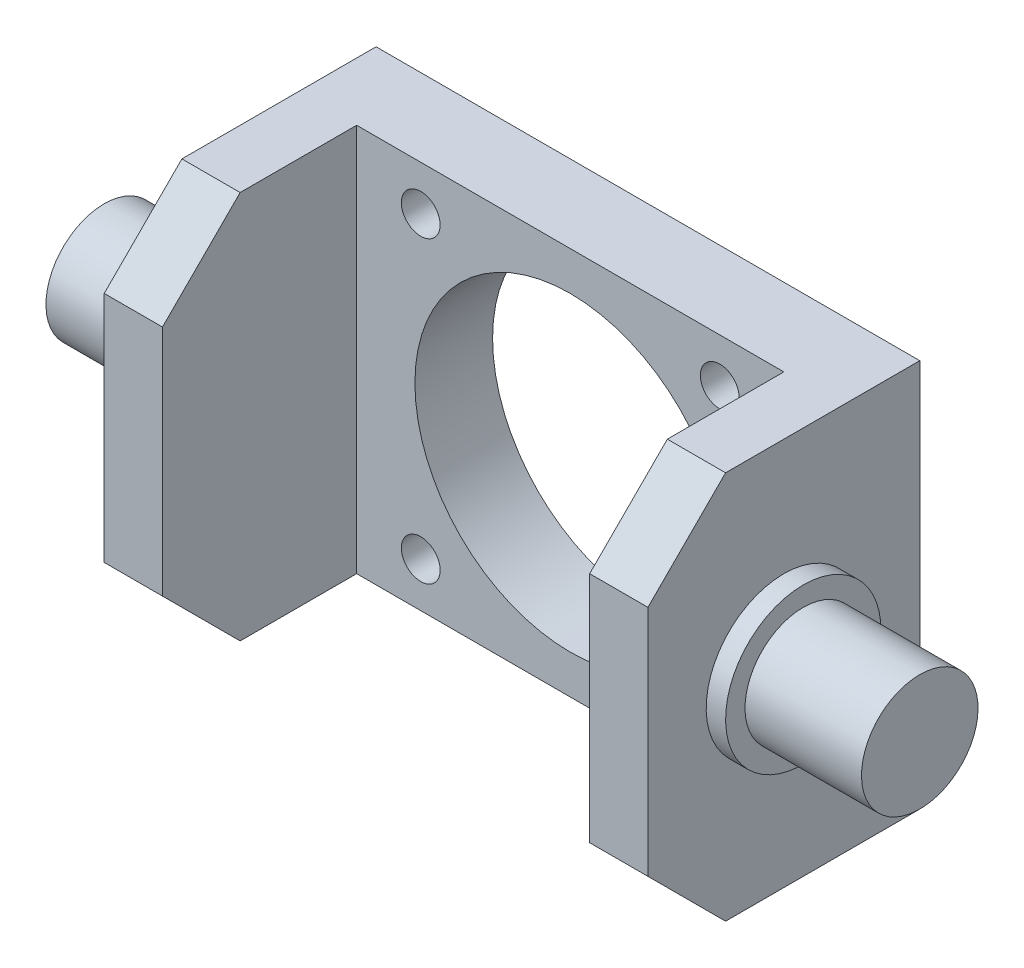
ISO-10303-21;
HEADER;
FILE_DESCRIPTION(('STEP AP214'),'2;1');
FILE_NAME('part.step','',(''),(''),'','','');
FILE_SCHEMA(('AUTOMOTIVE_DESIGN { 1 0 10303 214 1 1 1 1 }'));
ENDSEC;
DATA;
#1=APPLICATION_CONTEXT('core data for automotive mechanical design processes');
#2=APPLICATION_PROTOCOL_DEFINITION('international standard','automotive_design',2000,#1);
#3=PRODUCT_CONTEXT('',#1,'mechanical');
#4=PRODUCT('Part','Part','',(#3));
#5=PRODUCT_RELATED_PRODUCT_CATEGORY('part','',(#4));
#6=PRODUCT_DEFINITION_FORMATION('','',#4);
#7=PRODUCT_DEFINITION_CONTEXT('part definition',#1,'design');
#8=PRODUCT_DEFINITION('design','',#6,#7);
#9=PRODUCT_DEFINITION_SHAPE('','',#8);
#10=(LENGTH_UNIT() NAMED_UNIT(*) SI_UNIT(.MILLI.,.METRE.));
#11=(NAMED_UNIT(*) PLANE_ANGLE_UNIT() SI_UNIT($,.RADIAN.));
#12=(NAMED_UNIT(*) SI_UNIT($,.STERADIAN.) SOLID_ANGLE_UNIT());
#13=UNCERTAINTY_MEASURE_WITH_UNIT(LENGTH_MEASURE(1.E-05),#10,'distance_accuracy_value','');
#14=(GEOMETRIC_REPRESENTATION_CONTEXT(3) GLOBAL_UNCERTAINTY_ASSIGNED_CONTEXT((#13)) GLOBAL_UNIT_ASSIGNED_CONTEXT((#10,
#11,#12)) REPRESENTATION_CONTEXT('',''));
#15=CARTESIAN_POINT('',(0.,0.,0.));
#16=DIRECTION('',(0.,0.,1.));
#17=DIRECTION('',(1.,0.,0.));
#18=AXIS2_PLACEMENT_3D('',#15,#16,#17);
#19=CARTESIAN_POINT('',(0.,0.,4.));
#20=DIRECTION('',(0.,0.,1.));
#21=DIRECTION('',(1.,0.,0.));
#22=AXIS2_PLACEMENT_3D('',#19,#20,#21);
#23=PLANE('',#22);
#24=CARTESIAN_POINT('',(-7.7,7.7,4.));
#25=DIRECTION('',(0.,0.,1.));
#26=DIRECTION('',(1.,0.,0.));
#27=AXIS2_PLACEMENT_3D('',#24,#25,#26);
#28=CIRCLE('',#27,1.);
#29=CARTESIAN_POINT('',(-6.7,7.7,4.));
#30=VERTEX_POINT('',#29);
#31=EDGE_CURVE('E187',#30,#30,#28,.T.);
#32=ORIENTED_EDGE('',*,*,#31,.F.);
#33=EDGE_LOOP('',(#32));
#34=FACE_BOUND('',#33,.T.);
#35=CARTESIAN_POINT('',(0.,0.,4.));
#36=DIRECTION('',(0.,0.,1.));
#37=DIRECTION('',(1.,0.,0.));
#38=AXIS2_PLACEMENT_3D('',#35,#36,#37);
#39=CIRCLE('',#38,8.);
#40=CARTESIAN_POINT('',(8.,0.,4.));
#41=VERTEX_POINT('',#40);
#42=EDGE_CURVE('E203',#41,#41,#39,.T.);
#43=ORIENTED_EDGE('',*,*,#42,.F.);
#44=EDGE_LOOP('',(#43));
#45=FACE_BOUND('',#44,.T.);
#46=CARTESIAN_POINT('',(7.7,-7.7,4.));
#47=DIRECTION('',(0.,0.,1.));
#48=DIRECTION('',(1.,0.,0.));
#49=AXIS2_PLACEMENT_3D('',#46,#47,#48);
#50=CIRCLE('',#49,1.);
#51=CARTESIAN_POINT('',(8.7,-7.7,4.));
#52=VERTEX_POINT('',#51);
#53=EDGE_CURVE('E211',#52,#52,#50,.T.);
#54=ORIENTED_EDGE('',*,*,#53,.F.);
#55=EDGE_LOOP('',(#54));
#56=FACE_BOUND('',#55,.T.);
#57=CARTESIAN_POINT('',(-7.7,-7.7,4.));
#58=DIRECTION('',(0.,0.,1.));
#59=DIRECTION('',(1.,0.,0.));
#60=AXIS2_PLACEMENT_3D('',#57,#58,#59);
#61=CIRCLE('',#60,1.);
#62=CARTESIAN_POINT('',(-6.69999999999999,-7.7,4.));
#63=VERTEX_POINT('',#62);
#64=EDGE_CURVE('E195',#63,#63,#61,.T.);
#65=ORIENTED_EDGE('',*,*,#64,.F.);
#66=EDGE_LOOP('',(#65));
#67=FACE_BOUND('',#66,.T.);
#68=CARTESIAN_POINT('',(7.7,7.7,4.));
#69=DIRECTION('',(0.,0.,1.));
#70=DIRECTION('',(1.,0.,0.));
#71=AXIS2_PLACEMENT_3D('',#68,#69,#70);
#72=CIRCLE('',#71,1.);
#73=CARTESIAN_POINT('',(8.7,7.7,4.));
#74=VERTEX_POINT('',#73);
#75=EDGE_CURVE('E179',#74,#74,#72,.T.);
#76=ORIENTED_EDGE('',*,*,#75,.F.);
#77=EDGE_LOOP('',(#76));
#78=FACE_BOUND('',#77,.T.);
#79=DIRECTION('',(1.,0.,0.));
#80=VECTOR('',#79,1.);
#81=CARTESIAN_POINT('',(-14.,-10.,4.));
#82=LINE('',#81,#80);
#83=CARTESIAN_POINT('',(-11.,-10.,4.));
#84=VERTEX_POINT('',#83);
#85=CARTESIAN_POINT('',(11.,-10.,4.));
#86=VERTEX_POINT('',#85);
#87=EDGE_CURVE('E158',#84,#86,#82,.T.);
#88=ORIENTED_EDGE('',*,*,#87,.T.);
#89=DIRECTION('',(0.,-1.,0.));
#90=VECTOR('',#89,1.);
#91=CARTESIAN_POINT('',(11.,10.,4.));
#92=LINE('',#91,#90);
#93=CARTESIAN_POINT('',(11.,10.,4.));
#94=VERTEX_POINT('',#93);
#95=EDGE_CURVE('E156',#94,#86,#92,.T.);
#96=ORIENTED_EDGE('',*,*,#95,.F.);
#97=DIRECTION('',(-1.,0.,0.));
#98=VECTOR('',#97,1.);
#99=CARTESIAN_POINT('',(-14.,10.,4.));
#100=LINE('',#99,#98);
#101=CARTESIAN_POINT('',(-11.,10.,4.));
#102=VERTEX_POINT('',#101);
#103=EDGE_CURVE('E139',#94,#102,#100,.T.);
#104=ORIENTED_EDGE('',*,*,#103,.T.);
#105=DIRECTION('',(0.,1.,0.));
#106=VECTOR('',#105,1.);
#107=CARTESIAN_POINT('',(-11.,10.,4.));
#108=LINE('',#107,#106);
#109=EDGE_CURVE('E153',#84,#102,#108,.T.);
#110=ORIENTED_EDGE('',*,*,#109,.F.);
#111=EDGE_LOOP('',(#88,#96,#104,#110));
#112=FACE_BOUND('',#111,.T.);
#113=ADVANCED_FACE('F43',(#34,#45,#56,#67,#78,#112),#23,.T.);
#114=CARTESIAN_POINT('',(0.,0.,0.));
#115=DIRECTION('',(0.,0.,1.));
#116=DIRECTION('',(1.,0.,0.));
#117=AXIS2_PLACEMENT_3D('',#114,#115,#116);
#118=PLANE('',#117);
#119=DIRECTION('',(0.,1.,0.));
#120=VECTOR('',#119,1.);
#121=CARTESIAN_POINT('',(14.,10.,0.));
#122=LINE('',#121,#120);
#123=CARTESIAN_POINT('',(14.,-10.,0.));
#124=VERTEX_POINT('',#123);
#125=CARTESIAN_POINT('',(14.,10.,0.));
#126=VERTEX_POINT('',#125);
#127=EDGE_CURVE('E215',#124,#126,#122,.T.);
#128=ORIENTED_EDGE('',*,*,#127,.F.);
#129=DIRECTION('',(1.,0.,0.));
#130=VECTOR('',#129,1.);
#131=CARTESIAN_POINT('',(-14.,-10.,0.));
#132=LINE('',#131,#130);
#133=CARTESIAN_POINT('',(-14.,-10.,0.));
#134=VERTEX_POINT('',#133);
#135=EDGE_CURVE('E159',#134,#124,#132,.T.);
#136=ORIENTED_EDGE('',*,*,#135,.F.);
#137=DIRECTION('',(0.,-1.,0.));
#138=VECTOR('',#137,1.);
#139=CARTESIAN_POINT('',(-14.,10.,0.));
#140=LINE('',#139,#138);
#141=CARTESIAN_POINT('',(-14.,10.,0.));
#142=VERTEX_POINT('',#141);
#143=EDGE_CURVE('E229',#142,#134,#140,.T.);
#144=ORIENTED_EDGE('',*,*,#143,.F.);
#145=DIRECTION('',(-1.,0.,0.));
#146=VECTOR('',#145,1.);
#147=CARTESIAN_POINT('',(-14.,10.,0.));
#148=LINE('',#147,#146);
#149=EDGE_CURVE('E225',#126,#142,#148,.T.);
#150=ORIENTED_EDGE('',*,*,#149,.F.);
#151=EDGE_LOOP('',(#128,#136,#144,#150));
#152=FACE_BOUND('',#151,.T.);
#153=CARTESIAN_POINT('',(7.7,-7.7,0.));
#154=DIRECTION('',(0.,0.,1.));
#155=DIRECTION('',(1.,0.,0.));
#156=AXIS2_PLACEMENT_3D('',#153,#154,#155);
#157=CIRCLE('',#156,1.);
#158=CARTESIAN_POINT('',(8.7,-7.7,0.));
#159=VERTEX_POINT('',#158);
#160=EDGE_CURVE('E207',#159,#159,#157,.T.);
#161=ORIENTED_EDGE('',*,*,#160,.T.);
#162=EDGE_LOOP('',(#161));
#163=FACE_BOUND('',#162,.T.);
#164=CARTESIAN_POINT('',(0.,0.,0.));
#165=DIRECTION('',(0.,0.,1.));
#166=DIRECTION('',(1.,0.,0.));
#167=AXIS2_PLACEMENT_3D('',#164,#165,#166);
#168=CIRCLE('',#167,8.);
#169=CARTESIAN_POINT('',(8.,0.,0.));
#170=VERTEX_POINT('',#169);
#171=EDGE_CURVE('E199',#170,#170,#168,.T.);
#172=ORIENTED_EDGE('',*,*,#171,.T.);
#173=EDGE_LOOP('',(#172));
#174=FACE_BOUND('',#173,.T.);
#175=CARTESIAN_POINT('',(-7.7,-7.7,0.));
#176=DIRECTION('',(0.,0.,1.));
#177=DIRECTION('',(1.,0.,0.));
#178=AXIS2_PLACEMENT_3D('',#175,#176,#177);
#179=CIRCLE('',#178,1.);
#180=CARTESIAN_POINT('',(-6.69999999999999,-7.7,0.));
#181=VERTEX_POINT('',#180);
#182=EDGE_CURVE('E191',#181,#181,#179,.T.);
#183=ORIENTED_EDGE('',*,*,#182,.T.);
#184=EDGE_LOOP('',(#183));
#185=FACE_BOUND('',#184,.T.);
#186=CARTESIAN_POINT('',(-7.7,7.7,0.));
#187=DIRECTION('',(0.,0.,1.));
#188=DIRECTION('',(1.,0.,0.));
#189=AXIS2_PLACEMENT_3D('',#186,#187,#188);
#190=CIRCLE('',#189,1.);
#191=CARTESIAN_POINT('',(-6.7,7.7,0.));
#192=VERTEX_POINT('',#191);
#193=EDGE_CURVE('E183',#192,#192,#190,.T.);
#194=ORIENTED_EDGE('',*,*,#193,.T.);
#195=EDGE_LOOP('',(#194));
#196=FACE_BOUND('',#195,.T.);
#197=CARTESIAN_POINT('',(7.7,7.7,0.));
#198=DIRECTION('',(0.,0.,1.));
#199=DIRECTION('',(1.,0.,0.));
#200=AXIS2_PLACEMENT_3D('',#197,#198,#199);
#201=CIRCLE('',#200,1.);
#202=CARTESIAN_POINT('',(8.7,7.7,0.));
#203=VERTEX_POINT('',#202);
#204=EDGE_CURVE('E178',#203,#203,#201,.T.);
#205=ORIENTED_EDGE('',*,*,#204,.T.);
#206=EDGE_LOOP('',(#205));
#207=FACE_BOUND('',#206,.T.);
#208=ADVANCED_FACE('F328',(#152,#163,#174,#185,#196,#207),#118,.F.);
#209=CARTESIAN_POINT('',(14.,10.,4.));
#210=DIRECTION('',(-1.,0.,0.));
#211=DIRECTION('',(0.,-1.,0.));
#212=AXIS2_PLACEMENT_3D('',#209,#210,#211);
#213=PLANE('',#212);
#214=CARTESIAN_POINT('',(14.,0.,7.));
#215=DIRECTION('',(1.,0.,0.));
#216=DIRECTION('',(0.,1.,0.));
#217=AXIS2_PLACEMENT_3D('',#214,#215,#216);
#218=CIRCLE('',#217,4.);
#219=CARTESIAN_POINT('',(14.,4.,7.));
#220=VERTEX_POINT('',#219);
#221=EDGE_CURVE('E247',#220,#220,#218,.T.);
#222=ORIENTED_EDGE('',*,*,#221,.F.);
#223=EDGE_LOOP('',(#222));
#224=FACE_BOUND('',#223,.T.);
#225=DIRECTION('',(0.,1.,0.));
#226=VECTOR('',#225,1.);
#227=CARTESIAN_POINT('',(14.,10.,14.));
#228=LINE('',#227,#226);
#229=CARTESIAN_POINT('',(14.,-6.00000000000001,14.));
#230=VERTEX_POINT('',#229);
#231=CARTESIAN_POINT('',(14.,6.,14.));
#232=VERTEX_POINT('',#231);
#233=EDGE_CURVE('E301',#230,#232,#228,.T.);
#234=ORIENTED_EDGE('',*,*,#233,.F.);
#235=DIRECTION('',(0.,0.707106781186546,0.707106781186549));
#236=VECTOR('',#235,1.);
#237=CARTESIAN_POINT('',(14.,-6.00000000000001,14.));
#238=LINE('',#237,#236);
#239=CARTESIAN_POINT('',(14.,-10.,9.99999999999999));
#240=VERTEX_POINT('',#239);
#241=EDGE_CURVE('E290',#230,#240,#238,.F.);
#242=ORIENTED_EDGE('',*,*,#241,.T.);
#243=DIRECTION('',(0.,0.,-1.));
#244=VECTOR('',#243,1.);
#245=CARTESIAN_POINT('',(14.,-10.,4.));
#246=LINE('',#245,#244);
#247=EDGE_CURVE('E221',#240,#124,#246,.T.);
#248=ORIENTED_EDGE('',*,*,#247,.T.);
#249=ORIENTED_EDGE('',*,*,#127,.T.);
#250=DIRECTION('',(0.,0.,-1.));
#251=VECTOR('',#250,1.);
#252=CARTESIAN_POINT('',(14.,10.,4.));
#253=LINE('',#252,#251);
#254=CARTESIAN_POINT('',(14.,10.,9.99999999999999));
#255=VERTEX_POINT('',#254);
#256=EDGE_CURVE('E244',#255,#126,#253,.T.);
#257=ORIENTED_EDGE('',*,*,#256,.F.);
#258=DIRECTION('',(0.,0.707106781186546,-0.707106781186549));
#259=VECTOR('',#258,1.);
#260=CARTESIAN_POINT('',(14.,6.,14.));
#261=LINE('',#260,#259);
#262=EDGE_CURVE('E287',#255,#232,#261,.F.);
#263=ORIENTED_EDGE('',*,*,#262,.T.);
#264=EDGE_LOOP('',(#234,#242,#248,#249,#257,#263));
#265=FACE_BOUND('',#264,.T.);
#266=ADVANCED_FACE('F300',(#224,#265),#213,.F.);
#267=CARTESIAN_POINT('',(-14.,10.,4.));
#268=DIRECTION('',(0.,-1.,0.));
#269=DIRECTION('',(0.,0.,-1.));
#270=AXIS2_PLACEMENT_3D('',#267,#268,#269);
#271=PLANE('',#270);
#272=DIRECTION('',(0.,0.,-1.));
#273=VECTOR('',#272,1.);
#274=CARTESIAN_POINT('',(-14.,10.,4.));
#275=LINE('',#274,#273);
#276=CARTESIAN_POINT('',(-14.,10.,9.99999999999999));
#277=VERTEX_POINT('',#276);
#278=EDGE_CURVE('E241',#277,#142,#275,.T.);
#279=ORIENTED_EDGE('',*,*,#278,.F.);
#280=DIRECTION('',(1.,0.,0.));
#281=VECTOR('',#280,1.);
#282=CARTESIAN_POINT('',(-11.,10.,9.99999999999999));
#283=LINE('',#282,#281);
#284=CARTESIAN_POINT('',(-11.,10.,9.99999999999999));
#285=VERTEX_POINT('',#284);
#286=EDGE_CURVE('E141',#277,#285,#283,.T.);
#287=ORIENTED_EDGE('',*,*,#286,.T.);
#288=DIRECTION('',(0.,0.,-1.));
#289=VECTOR('',#288,1.);
#290=CARTESIAN_POINT('',(-11.,10.,14.));
#291=LINE('',#290,#289);
#292=EDGE_CURVE('E134',#285,#102,#291,.T.);
#293=ORIENTED_EDGE('',*,*,#292,.T.);
#294=ORIENTED_EDGE('',*,*,#103,.F.);
#295=DIRECTION('',(0.,0.,-1.));
#296=VECTOR('',#295,1.);
#297=CARTESIAN_POINT('',(11.,10.,14.));
#298=LINE('',#297,#296);
#299=CARTESIAN_POINT('',(11.,10.,9.99999999999999));
#300=VERTEX_POINT('',#299);
#301=EDGE_CURVE('E166',#300,#94,#298,.T.);
#302=ORIENTED_EDGE('',*,*,#301,.F.);
#303=DIRECTION('',(1.,0.,0.));
#304=VECTOR('',#303,1.);
#305=CARTESIAN_POINT('',(-14.,10.,9.99999999999999));
#306=LINE('',#305,#304);
#307=EDGE_CURVE('E275',#300,#255,#306,.T.);
#308=ORIENTED_EDGE('',*,*,#307,.T.);
#309=ORIENTED_EDGE('',*,*,#256,.T.);
#310=ORIENTED_EDGE('',*,*,#149,.T.);
#311=EDGE_LOOP('',(#279,#287,#293,#294,#302,#308,#309,#310));
#312=FACE_BOUND('',#311,.T.);
#313=ADVANCED_FACE('F137',(#312),#271,.F.);
#314=CARTESIAN_POINT('',(-14.,10.,4.));
#315=DIRECTION('',(1.,0.,0.));
#316=DIRECTION('',(0.,1.,0.));
#317=AXIS2_PLACEMENT_3D('',#314,#315,#316);
#318=PLANE('',#317);
#319=CARTESIAN_POINT('',(-14.,0.,7.));
#320=DIRECTION('',(1.,0.,0.));
#321=DIRECTION('',(0.,1.,0.));
#322=AXIS2_PLACEMENT_3D('',#319,#320,#321);
#323=CIRCLE('',#322,4.);
#324=CARTESIAN_POINT('',(-14.,4.,7.));
#325=VERTEX_POINT('',#324);
#326=EDGE_CURVE('E361',#325,#325,#323,.T.);
#327=ORIENTED_EDGE('',*,*,#326,.T.);
#328=EDGE_LOOP('',(#327));
#329=FACE_BOUND('',#328,.T.);
#330=DIRECTION('',(0.,0.,-1.));
#331=VECTOR('',#330,1.);
#332=CARTESIAN_POINT('',(-14.,-10.,4.));
#333=LINE('',#332,#331);
#334=CARTESIAN_POINT('',(-14.,-10.,9.99999999999999));
#335=VERTEX_POINT('',#334);
#336=EDGE_CURVE('E238',#335,#134,#333,.T.);
#337=ORIENTED_EDGE('',*,*,#336,.F.);
#338=DIRECTION('',(0.,0.707106781186546,0.707106781186549));
#339=VECTOR('',#338,1.);
#340=CARTESIAN_POINT('',(-14.,-6.00000000000001,14.));
#341=LINE('',#340,#339);
#342=CARTESIAN_POINT('',(-14.,-6.00000000000001,14.));
#343=VERTEX_POINT('',#342);
#344=EDGE_CURVE('E272',#335,#343,#341,.T.);
#345=ORIENTED_EDGE('',*,*,#344,.T.);
#346=DIRECTION('',(0.,-1.,0.));
#347=VECTOR('',#346,1.);
#348=CARTESIAN_POINT('',(-14.,10.,14.));
#349=LINE('',#348,#347);
#350=CARTESIAN_POINT('',(-14.,6.,14.));
#351=VERTEX_POINT('',#350);
#352=EDGE_CURVE('E165',#351,#343,#349,.T.);
#353=ORIENTED_EDGE('',*,*,#352,.F.);
#354=DIRECTION('',(0.,0.707106781186546,-0.707106781186549));
#355=VECTOR('',#354,1.);
#356=CARTESIAN_POINT('',(-14.,6.,14.));
#357=LINE('',#356,#355);
#358=EDGE_CURVE('E269',#351,#277,#357,.T.);
#359=ORIENTED_EDGE('',*,*,#358,.T.);
#360=ORIENTED_EDGE('',*,*,#278,.T.);
#361=ORIENTED_EDGE('',*,*,#143,.T.);
#362=EDGE_LOOP('',(#337,#345,#353,#359,#360,#361));
#363=FACE_BOUND('',#362,.T.);
#364=ADVANCED_FACE('F403',(#329,#363),#318,.F.);
#365=CARTESIAN_POINT('',(-14.,-10.,4.));
#366=DIRECTION('',(0.,1.,0.));
#367=DIRECTION('',(0.,0.,1.));
#368=AXIS2_PLACEMENT_3D('',#365,#366,#367);
#369=PLANE('',#368);
#370=DIRECTION('',(0.,0.,-1.));
#371=VECTOR('',#370,1.);
#372=CARTESIAN_POINT('',(-11.,-10.,14.));
#373=LINE('',#372,#371);
#374=CARTESIAN_POINT('',(-11.,-10.,9.99999999999999));
#375=VERTEX_POINT('',#374);
#376=EDGE_CURVE('E146',#375,#84,#373,.T.);
#377=ORIENTED_EDGE('',*,*,#376,.F.);
#378=DIRECTION('',(-1.,0.,0.));
#379=VECTOR('',#378,1.);
#380=CARTESIAN_POINT('',(-14.,-10.,9.99999999999999));
#381=LINE('',#380,#379);
#382=EDGE_CURVE('E266',#375,#335,#381,.T.);
#383=ORIENTED_EDGE('',*,*,#382,.T.);
#384=ORIENTED_EDGE('',*,*,#336,.T.);
#385=ORIENTED_EDGE('',*,*,#135,.T.);
#386=ORIENTED_EDGE('',*,*,#247,.F.);
#387=DIRECTION('',(-1.,0.,0.));
#388=VECTOR('',#387,1.);
#389=CARTESIAN_POINT('',(-14.,-10.,9.99999999999999));
#390=LINE('',#389,#388);
#391=CARTESIAN_POINT('',(11.,-10.,9.99999999999999));
#392=VERTEX_POINT('',#391);
#393=EDGE_CURVE('E263',#240,#392,#390,.T.);
#394=ORIENTED_EDGE('',*,*,#393,.T.);
#395=DIRECTION('',(0.,0.,-1.));
#396=VECTOR('',#395,1.);
#397=CARTESIAN_POINT('',(11.,-10.,14.));
#398=LINE('',#397,#396);
#399=EDGE_CURVE('E172',#392,#86,#398,.T.);
#400=ORIENTED_EDGE('',*,*,#399,.T.);
#401=ORIENTED_EDGE('',*,*,#87,.F.);
#402=EDGE_LOOP('',(#377,#383,#384,#385,#386,#394,#400,#401));
#403=FACE_BOUND('',#402,.T.);
#404=ADVANCED_FACE('F317',(#403),#369,.F.);
#405=CARTESIAN_POINT('',(7.7,-7.7,4.));
#406=DIRECTION('',(0.,0.,-1.));
#407=DIRECTION('',(-1.,0.,0.));
#408=AXIS2_PLACEMENT_3D('',#405,#406,#407);
#409=CYLINDRICAL_SURFACE('',#408,1.);
#410=ORIENTED_EDGE('',*,*,#53,.T.);
#411=EDGE_LOOP('',(#410));
#412=FACE_BOUND('',#411,.T.);
#413=ORIENTED_EDGE('',*,*,#160,.F.);
#414=EDGE_LOOP('',(#413));
#415=FACE_BOUND('',#414,.T.);
#416=ADVANCED_FACE('F398',(#412,#415),#409,.F.);
#417=CARTESIAN_POINT('',(0.,0.,4.));
#418=DIRECTION('',(0.,0.,-1.));
#419=DIRECTION('',(-1.,0.,0.));
#420=AXIS2_PLACEMENT_3D('',#417,#418,#419);
#421=CYLINDRICAL_SURFACE('',#420,8.);
#422=ORIENTED_EDGE('',*,*,#42,.T.);
#423=EDGE_LOOP('',(#422));
#424=FACE_BOUND('',#423,.T.);
#425=ORIENTED_EDGE('',*,*,#171,.F.);
#426=EDGE_LOOP('',(#425));
#427=FACE_BOUND('',#426,.T.);
#428=ADVANCED_FACE('F475',(#424,#427),#421,.F.);
#429=CARTESIAN_POINT('',(-7.7,-7.7,4.));
#430=DIRECTION('',(0.,0.,-1.));
#431=DIRECTION('',(-1.,0.,0.));
#432=AXIS2_PLACEMENT_3D('',#429,#430,#431);
#433=CYLINDRICAL_SURFACE('',#432,1.);
#434=ORIENTED_EDGE('',*,*,#64,.T.);
#435=EDGE_LOOP('',(#434));
#436=FACE_BOUND('',#435,.T.);
#437=ORIENTED_EDGE('',*,*,#182,.F.);
#438=EDGE_LOOP('',(#437));
#439=FACE_BOUND('',#438,.T.);
#440=ADVANCED_FACE('F472',(#436,#439),#433,.F.);
#441=CARTESIAN_POINT('',(-7.7,7.7,4.));
#442=DIRECTION('',(0.,0.,-1.));
#443=DIRECTION('',(-1.,0.,0.));
#444=AXIS2_PLACEMENT_3D('',#441,#442,#443);
#445=CYLINDRICAL_SURFACE('',#444,1.);
#446=ORIENTED_EDGE('',*,*,#31,.T.);
#447=EDGE_LOOP('',(#446));
#448=FACE_BOUND('',#447,.T.);
#449=ORIENTED_EDGE('',*,*,#193,.F.);
#450=EDGE_LOOP('',(#449));
#451=FACE_BOUND('',#450,.T.);
#452=ADVANCED_FACE('F468',(#448,#451),#445,.F.);
#453=CARTESIAN_POINT('',(7.7,7.7,4.));
#454=DIRECTION('',(0.,0.,-1.));
#455=DIRECTION('',(-1.,0.,0.));
#456=AXIS2_PLACEMENT_3D('',#453,#454,#455);
#457=CYLINDRICAL_SURFACE('',#456,1.);
#458=ORIENTED_EDGE('',*,*,#75,.T.);
#459=EDGE_LOOP('',(#458));
#460=FACE_BOUND('',#459,.T.);
#461=ORIENTED_EDGE('',*,*,#204,.F.);
#462=EDGE_LOOP('',(#461));
#463=FACE_BOUND('',#462,.T.);
#464=ADVANCED_FACE('F465',(#460,#463),#457,.F.);
#465=CARTESIAN_POINT('',(-11.,10.,14.));
#466=DIRECTION('',(-1.,0.,0.));
#467=DIRECTION('',(0.,-1.,0.));
#468=AXIS2_PLACEMENT_3D('',#465,#466,#467);
#469=PLANE('',#468);
#470=DIRECTION('',(0.,1.,0.));
#471=VECTOR('',#470,1.);
#472=CARTESIAN_POINT('',(-11.,10.,14.));
#473=LINE('',#472,#471);
#474=CARTESIAN_POINT('',(-11.,-6.00000000000001,14.));
#475=VERTEX_POINT('',#474);
#476=CARTESIAN_POINT('',(-11.,6.,14.));
#477=VERTEX_POINT('',#476);
#478=EDGE_CURVE('E147',#475,#477,#473,.T.);
#479=ORIENTED_EDGE('',*,*,#478,.F.);
#480=DIRECTION('',(0.,-0.707106781186546,-0.707106781186549));
#481=VECTOR('',#480,1.);
#482=CARTESIAN_POINT('',(-11.,-6.00000000000001,14.));
#483=LINE('',#482,#481);
#484=EDGE_CURVE('E260',#475,#375,#483,.T.);
#485=ORIENTED_EDGE('',*,*,#484,.T.);
#486=ORIENTED_EDGE('',*,*,#376,.T.);
#487=ORIENTED_EDGE('',*,*,#109,.T.);
#488=ORIENTED_EDGE('',*,*,#292,.F.);
#489=DIRECTION('',(0.,-0.707106781186546,0.707106781186549));
#490=VECTOR('',#489,1.);
#491=CARTESIAN_POINT('',(-11.,6.,14.));
#492=LINE('',#491,#490);
#493=EDGE_CURVE('E257',#285,#477,#492,.T.);
#494=ORIENTED_EDGE('',*,*,#493,.T.);
#495=EDGE_LOOP('',(#479,#485,#486,#487,#488,#494));
#496=FACE_BOUND('',#495,.T.);
#497=ADVANCED_FACE('F162',(#496),#469,.F.);
#498=CARTESIAN_POINT('',(0.,0.,14.));
#499=DIRECTION('',(0.,0.,1.));
#500=DIRECTION('',(1.,0.,0.));
#501=AXIS2_PLACEMENT_3D('',#498,#499,#500);
#502=PLANE('',#501);
#503=ORIENTED_EDGE('',*,*,#352,.T.);
#504=DIRECTION('',(1.,0.,0.));
#505=VECTOR('',#504,1.);
#506=CARTESIAN_POINT('',(-11.,-6.00000000000001,14.));
#507=LINE('',#506,#505);
#508=EDGE_CURVE('E252',#343,#475,#507,.T.);
#509=ORIENTED_EDGE('',*,*,#508,.T.);
#510=ORIENTED_EDGE('',*,*,#478,.T.);
#511=DIRECTION('',(-1.,0.,0.));
#512=VECTOR('',#511,1.);
#513=CARTESIAN_POINT('',(-14.,6.,14.));
#514=LINE('',#513,#512);
#515=EDGE_CURVE('E248',#477,#351,#514,.T.);
#516=ORIENTED_EDGE('',*,*,#515,.T.);
#517=EDGE_LOOP('',(#503,#509,#510,#516));
#518=FACE_BOUND('',#517,.T.);
#519=ADVANCED_FACE('F336',(#518),#502,.T.);
#520=CARTESIAN_POINT('',(11.,10.,14.));
#521=DIRECTION('',(1.,0.,0.));
#522=DIRECTION('',(0.,1.,0.));
#523=AXIS2_PLACEMENT_3D('',#520,#521,#522);
#524=PLANE('',#523);
#525=ORIENTED_EDGE('',*,*,#399,.F.);
#526=DIRECTION('',(0.,-0.707106781186546,-0.707106781186549));
#527=VECTOR('',#526,1.);
#528=CARTESIAN_POINT('',(11.,-6.,14.));
#529=LINE('',#528,#527);
#530=CARTESIAN_POINT('',(11.,-6.00000000000001,14.));
#531=VERTEX_POINT('',#530);
#532=EDGE_CURVE('E11',#392,#531,#529,.F.);
#533=ORIENTED_EDGE('',*,*,#532,.T.);
#534=DIRECTION('',(0.,-1.,0.));
#535=VECTOR('',#534,1.);
#536=CARTESIAN_POINT('',(11.,10.,14.));
#537=LINE('',#536,#535);
#538=CARTESIAN_POINT('',(11.,6.,14.));
#539=VERTEX_POINT('',#538);
#540=EDGE_CURVE('E294',#539,#531,#537,.T.);
#541=ORIENTED_EDGE('',*,*,#540,.F.);
#542=DIRECTION('',(0.,-0.707106781186546,0.707106781186549));
#543=VECTOR('',#542,1.);
#544=CARTESIAN_POINT('',(11.,6.,14.));
#545=LINE('',#544,#543);
#546=EDGE_CURVE('E53',#539,#300,#545,.F.);
#547=ORIENTED_EDGE('',*,*,#546,.T.);
#548=ORIENTED_EDGE('',*,*,#301,.T.);
#549=ORIENTED_EDGE('',*,*,#95,.T.);
#550=EDGE_LOOP('',(#525,#533,#541,#547,#548,#549));
#551=FACE_BOUND('',#550,.T.);
#552=ADVANCED_FACE('F293',(#551),#524,.F.);
#553=CARTESIAN_POINT('',(0.,0.,14.));
#554=DIRECTION('',(0.,0.,-1.));
#555=DIRECTION('',(-1.,0.,0.));
#556=AXIS2_PLACEMENT_3D('',#553,#554,#555);
#557=PLANE('',#556);
#558=ORIENTED_EDGE('',*,*,#540,.T.);
#559=DIRECTION('',(1.,0.,0.));
#560=VECTOR('',#559,1.);
#561=CARTESIAN_POINT('',(0.,-6.00000000000001,14.));
#562=LINE('',#561,#560);
#563=EDGE_CURVE('E283',#531,#230,#562,.T.);
#564=ORIENTED_EDGE('',*,*,#563,.T.);
#565=ORIENTED_EDGE('',*,*,#233,.T.);
#566=DIRECTION('',(-1.,0.,0.));
#567=VECTOR('',#566,1.);
#568=CARTESIAN_POINT('',(0.,6.,14.));
#569=LINE('',#568,#567);
#570=EDGE_CURVE('E280',#232,#539,#569,.T.);
#571=ORIENTED_EDGE('',*,*,#570,.T.);
#572=EDGE_LOOP('',(#558,#564,#565,#571));
#573=FACE_BOUND('',#572,.T.);
#574=ADVANCED_FACE('F303',(#573),#557,.F.);
#575=CARTESIAN_POINT('',(15.,0.,7.));
#576=DIRECTION('',(-1.,0.,0.));
#577=DIRECTION('',(0.,-1.,0.));
#578=AXIS2_PLACEMENT_3D('',#575,#576,#577);
#579=CYLINDRICAL_SURFACE('',#578,4.);
#580=CARTESIAN_POINT('',(15.,0.,7.));
#581=DIRECTION('',(1.,0.,0.));
#582=DIRECTION('',(0.,1.,0.));
#583=AXIS2_PLACEMENT_3D('',#580,#581,#582);
#584=CIRCLE('',#583,4.);
#585=CARTESIAN_POINT('',(15.,4.,7.));
#586=VERTEX_POINT('',#585);
#587=EDGE_CURVE('E310',#586,#586,#584,.T.);
#588=ORIENTED_EDGE('',*,*,#587,.F.);
#589=EDGE_LOOP('',(#588));
#590=FACE_BOUND('',#589,.T.);
#591=ORIENTED_EDGE('',*,*,#221,.T.);
#592=EDGE_LOOP('',(#591));
#593=FACE_BOUND('',#592,.T.);
#594=ADVANCED_FACE('F452',(#590,#593),#579,.T.);
#595=CARTESIAN_POINT('',(15.,0.,0.));
#596=DIRECTION('',(1.,0.,0.));
#597=DIRECTION('',(0.,1.,0.));
#598=AXIS2_PLACEMENT_3D('',#595,#596,#597);
#599=PLANE('',#598);
#600=CARTESIAN_POINT('',(15.,0.,7.));
#601=DIRECTION('',(1.,0.,0.));
#602=DIRECTION('',(0.,1.,0.));
#603=AXIS2_PLACEMENT_3D('',#600,#601,#602);
#604=CIRCLE('',#603,3.);
#605=CARTESIAN_POINT('',(15.,3.,7.));
#606=VERTEX_POINT('',#605);
#607=EDGE_CURVE('E253',#606,#606,#604,.T.);
#608=ORIENTED_EDGE('',*,*,#607,.F.);
#609=EDGE_LOOP('',(#608));
#610=FACE_BOUND('',#609,.T.);
#611=ORIENTED_EDGE('',*,*,#587,.T.);
#612=EDGE_LOOP('',(#611));
#613=FACE_BOUND('',#612,.T.);
#614=ADVANCED_FACE('F448',(#610,#613),#599,.T.);
#615=CARTESIAN_POINT('',(21.,0.,7.));
#616=DIRECTION('',(-1.,0.,0.));
#617=DIRECTION('',(0.,-1.,0.));
#618=AXIS2_PLACEMENT_3D('',#615,#616,#617);
#619=CYLINDRICAL_SURFACE('',#618,3.);
#620=CARTESIAN_POINT('',(21.,0.,7.));
#621=DIRECTION('',(1.,0.,0.));
#622=DIRECTION('',(0.,1.,0.));
#623=AXIS2_PLACEMENT_3D('',#620,#621,#622);
#624=CIRCLE('',#623,3.);
#625=CARTESIAN_POINT('',(21.,3.,7.));
#626=VERTEX_POINT('',#625);
#627=EDGE_CURVE('E348',#626,#626,#624,.T.);
#628=ORIENTED_EDGE('',*,*,#627,.F.);
#629=EDGE_LOOP('',(#628));
#630=FACE_BOUND('',#629,.T.);
#631=ORIENTED_EDGE('',*,*,#607,.T.);
#632=EDGE_LOOP('',(#631));
#633=FACE_BOUND('',#632,.T.);
#634=ADVANCED_FACE('F445',(#630,#633),#619,.T.);
#635=CARTESIAN_POINT('',(21.,0.,7.));
#636=DIRECTION('',(1.,0.,0.));
#637=DIRECTION('',(0.,1.,0.));
#638=AXIS2_PLACEMENT_3D('',#635,#636,#637);
#639=PLANE('',#638);
#640=ORIENTED_EDGE('',*,*,#627,.T.);
#641=EDGE_LOOP('',(#640));
#642=FACE_BOUND('',#641,.T.);
#643=ADVANCED_FACE('F419',(#642),#639,.T.);
#644=CARTESIAN_POINT('',(0.,-6.00000000000001,14.));
#645=DIRECTION('',(0.,-0.707106781186549,0.707106781186546));
#646=DIRECTION('',(-1.,0.,0.));
#647=AXIS2_PLACEMENT_3D('',#644,#645,#646);
#648=PLANE('',#647);
#649=ORIENTED_EDGE('',*,*,#344,.F.);
#650=ORIENTED_EDGE('',*,*,#382,.F.);
#651=ORIENTED_EDGE('',*,*,#484,.F.);
#652=ORIENTED_EDGE('',*,*,#508,.F.);
#653=EDGE_LOOP('',(#649,#650,#651,#652));
#654=FACE_BOUND('',#653,.T.);
#655=ADVANCED_FACE('F413',(#654),#648,.T.);
#656=CARTESIAN_POINT('',(0.,6.,14.));
#657=DIRECTION('',(0.,0.707106781186549,0.707106781186546));
#658=DIRECTION('',(1.,0.,0.));
#659=AXIS2_PLACEMENT_3D('',#656,#657,#658);
#660=PLANE('',#659);
#661=ORIENTED_EDGE('',*,*,#493,.F.);
#662=ORIENTED_EDGE('',*,*,#286,.F.);
#663=ORIENTED_EDGE('',*,*,#358,.F.);
#664=ORIENTED_EDGE('',*,*,#515,.F.);
#665=EDGE_LOOP('',(#661,#662,#663,#664));
#666=FACE_BOUND('',#665,.T.);
#667=ADVANCED_FACE('F332',(#666),#660,.T.);
#668=CARTESIAN_POINT('',(0.,-6.00000000000001,14.));
#669=DIRECTION('',(0.,0.707106781186549,-0.707106781186546));
#670=DIRECTION('',(1.,0.,0.));
#671=AXIS2_PLACEMENT_3D('',#668,#669,#670);
#672=PLANE('',#671);
#673=ORIENTED_EDGE('',*,*,#532,.F.);
#674=ORIENTED_EDGE('',*,*,#393,.F.);
#675=ORIENTED_EDGE('',*,*,#241,.F.);
#676=ORIENTED_EDGE('',*,*,#563,.F.);
#677=EDGE_LOOP('',(#673,#674,#675,#676));
#678=FACE_BOUND('',#677,.T.);
#679=ADVANCED_FACE('F321',(#678),#672,.F.);
#680=CARTESIAN_POINT('',(0.,6.,14.));
#681=DIRECTION('',(0.,-0.707106781186549,-0.707106781186546));
#682=DIRECTION('',(-1.,0.,0.));
#683=AXIS2_PLACEMENT_3D('',#680,#681,#682);
#684=PLANE('',#683);
#685=ORIENTED_EDGE('',*,*,#262,.F.);
#686=ORIENTED_EDGE('',*,*,#307,.F.);
#687=ORIENTED_EDGE('',*,*,#546,.F.);
#688=ORIENTED_EDGE('',*,*,#570,.F.);
#689=EDGE_LOOP('',(#685,#686,#687,#688));
#690=FACE_BOUND('',#689,.T.);
#691=ADVANCED_FACE('F46',(#690),#684,.F.);
#692=CARTESIAN_POINT('',(-15.,0.,7.));
#693=DIRECTION('',(1.,0.,0.));
#694=DIRECTION('',(0.,1.,0.));
#695=AXIS2_PLACEMENT_3D('',#692,#693,#694);
#696=CYLINDRICAL_SURFACE('',#695,4.);
#697=CARTESIAN_POINT('',(-15.,0.,7.));
#698=DIRECTION('',(1.,0.,0.));
#699=DIRECTION('',(0.,1.,0.));
#700=AXIS2_PLACEMENT_3D('',#697,#698,#699);
#701=CIRCLE('',#700,4.);
#702=CARTESIAN_POINT('',(-15.,4.,7.));
#703=VERTEX_POINT('',#702);
#704=EDGE_CURVE('E356',#703,#703,#701,.T.);
#705=ORIENTED_EDGE('',*,*,#704,.T.);
#706=EDGE_LOOP('',(#705));
#707=FACE_BOUND('',#706,.T.);
#708=ORIENTED_EDGE('',*,*,#326,.F.);
#709=EDGE_LOOP('',(#708));
#710=FACE_BOUND('',#709,.T.);
#711=ADVANCED_FACE('F431',(#707,#710),#696,.T.);
#712=CARTESIAN_POINT('',(-15.,0.,0.));
#713=DIRECTION('',(-1.,0.,0.));
#714=DIRECTION('',(0.,1.,0.));
#715=AXIS2_PLACEMENT_3D('',#712,#713,#714);
#716=PLANE('',#715);
#717=CARTESIAN_POINT('',(-15.,0.,7.));
#718=DIRECTION('',(1.,0.,0.));
#719=DIRECTION('',(0.,1.,0.));
#720=AXIS2_PLACEMENT_3D('',#717,#718,#719);
#721=CIRCLE('',#720,3.);
#722=CARTESIAN_POINT('',(-15.,3.,7.));
#723=VERTEX_POINT('',#722);
#724=EDGE_CURVE('E369',#723,#723,#721,.T.);
#725=ORIENTED_EDGE('',*,*,#724,.T.);
#726=EDGE_LOOP('',(#725));
#727=FACE_BOUND('',#726,.T.);
#728=ORIENTED_EDGE('',*,*,#704,.F.);
#729=EDGE_LOOP('',(#728));
#730=FACE_BOUND('',#729,.T.);
#731=ADVANCED_FACE('F386',(#727,#730),#716,.T.);
#732=CARTESIAN_POINT('',(-21.,0.,7.));
#733=DIRECTION('',(1.,0.,0.));
#734=DIRECTION('',(0.,1.,0.));
#735=AXIS2_PLACEMENT_3D('',#732,#733,#734);
#736=CYLINDRICAL_SURFACE('',#735,3.);
#737=CARTESIAN_POINT('',(-21.,0.,7.));
#738=DIRECTION('',(1.,0.,0.));
#739=DIRECTION('',(0.,1.,0.));
#740=AXIS2_PLACEMENT_3D('',#737,#738,#739);
#741=CIRCLE('',#740,3.);
#742=CARTESIAN_POINT('',(-21.,3.,7.));
#743=VERTEX_POINT('',#742);
#744=EDGE_CURVE('E367',#743,#743,#741,.T.);
#745=ORIENTED_EDGE('',*,*,#744,.T.);
#746=EDGE_LOOP('',(#745));
#747=FACE_BOUND('',#746,.T.);
#748=ORIENTED_EDGE('',*,*,#724,.F.);
#749=EDGE_LOOP('',(#748));
#750=FACE_BOUND('',#749,.T.);
#751=ADVANCED_FACE('F377',(#747,#750),#736,.T.);
#752=CARTESIAN_POINT('',(-21.,0.,7.));
#753=DIRECTION('',(-1.,0.,0.));
#754=DIRECTION('',(0.,1.,0.));
#755=AXIS2_PLACEMENT_3D('',#752,#753,#754);
#756=PLANE('',#755);
#757=ORIENTED_EDGE('',*,*,#744,.F.);
#758=EDGE_LOOP('',(#757));
#759=FACE_BOUND('',#758,.T.);
#760=ADVANCED_FACE('F380',(#759),#756,.T.);
#761=CLOSED_SHELL('',(#113,#208,#266,#313,#364,#404,#416,#428,#440,#452,#464,#497,#519,#552,
#574,#594,#614,#634,#643,#655,#667,#679,#691,#711,#731,#751,#760));
#762=MANIFOLD_SOLID_BREP('B2',#761);
#763=ADVANCED_BREP_SHAPE_REPRESENTATION('',(#18,#762),#14);
#764=SHAPE_DEFINITION_REPRESENTATION(#9,#763);
ENDSEC;
END-ISO-10303-21;
